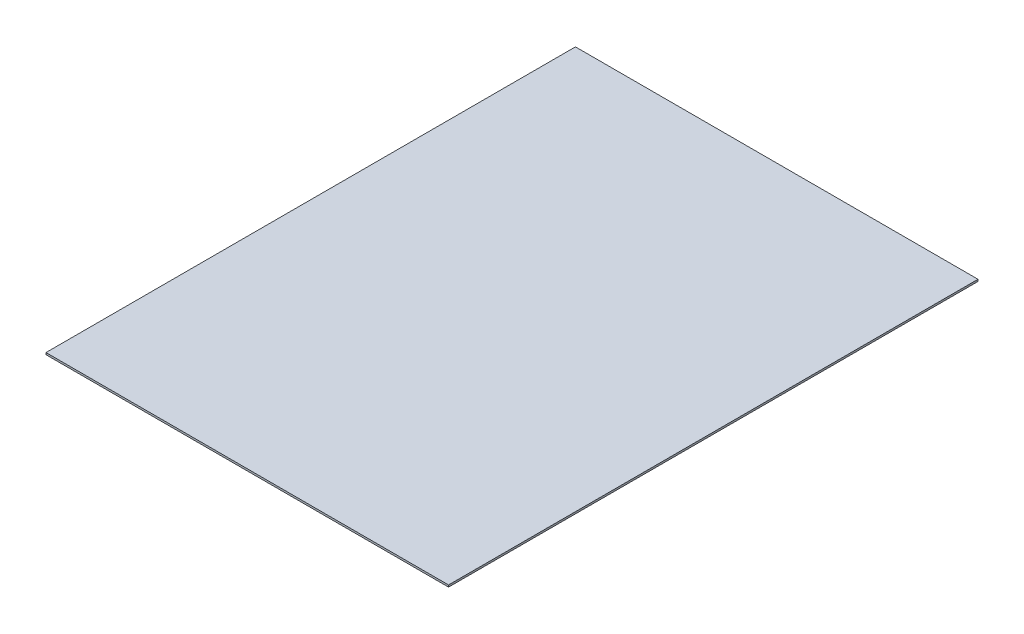
ISO-10303-21;
HEADER;
FILE_DESCRIPTION(('STEP AP214'),'2;1');
FILE_NAME('part.step','',(''),(''),'','','');
FILE_SCHEMA(('AUTOMOTIVE_DESIGN { 1 0 10303 214 1 1 1 1 }'));
ENDSEC;
DATA;
#1=APPLICATION_CONTEXT('core data for automotive mechanical design processes');
#2=APPLICATION_PROTOCOL_DEFINITION('international standard','automotive_design',2000,#1);
#3=PRODUCT_CONTEXT('',#1,'mechanical');
#4=PRODUCT('Part','Part','',(#3));
#5=PRODUCT_RELATED_PRODUCT_CATEGORY('part','',(#4));
#6=PRODUCT_DEFINITION_FORMATION('','',#4);
#7=PRODUCT_DEFINITION_CONTEXT('part definition',#1,'design');
#8=PRODUCT_DEFINITION('design','',#6,#7);
#9=PRODUCT_DEFINITION_SHAPE('','',#8);
#10=(LENGTH_UNIT() NAMED_UNIT(*) SI_UNIT(.MILLI.,.METRE.));
#11=(NAMED_UNIT(*) PLANE_ANGLE_UNIT() SI_UNIT($,.RADIAN.));
#12=(NAMED_UNIT(*) SI_UNIT($,.STERADIAN.) SOLID_ANGLE_UNIT());
#13=UNCERTAINTY_MEASURE_WITH_UNIT(LENGTH_MEASURE(1.E-05),#10,'distance_accuracy_value','');
#14=(GEOMETRIC_REPRESENTATION_CONTEXT(3) GLOBAL_UNCERTAINTY_ASSIGNED_CONTEXT((#13)) GLOBAL_UNIT_ASSIGNED_CONTEXT((#10,
#11,#12)) REPRESENTATION_CONTEXT('',''));
#15=CARTESIAN_POINT('',(0.,0.,0.));
#16=DIRECTION('',(0.,0.,1.));
#17=DIRECTION('',(1.,0.,0.));
#18=AXIS2_PLACEMENT_3D('',#15,#16,#17);
#19=CARTESIAN_POINT('',(737.5,7.,970.));
#20=DIRECTION('',(-1.,0.,0.));
#21=DIRECTION('',(0.,0.,1.));
#22=AXIS2_PLACEMENT_3D('',#19,#20,#21);
#23=PLANE('',#22);
#24=DIRECTION('',(0.,0.,-1.));
#25=VECTOR('',#24,1.);
#26=CARTESIAN_POINT('',(737.5,0.,970.));
#27=LINE('',#26,#25);
#28=CARTESIAN_POINT('',(737.5,0.,970.));
#29=VERTEX_POINT('',#28);
#30=CARTESIAN_POINT('',(737.5,0.,-970.));
#31=VERTEX_POINT('',#30);
#32=EDGE_CURVE('E97',#29,#31,#27,.T.);
#33=ORIENTED_EDGE('',*,*,#32,.T.);
#34=DIRECTION('',(0.,-1.,0.));
#35=VECTOR('',#34,1.);
#36=CARTESIAN_POINT('',(737.5,7.,-970.));
#37=LINE('',#36,#35);
#38=CARTESIAN_POINT('',(737.5,7.,-970.));
#39=VERTEX_POINT('',#38);
#40=EDGE_CURVE('E11',#39,#31,#37,.T.);
#41=ORIENTED_EDGE('',*,*,#40,.F.);
#42=DIRECTION('',(0.,0.,-1.));
#43=VECTOR('',#42,1.);
#44=CARTESIAN_POINT('',(737.5,7.,970.));
#45=LINE('',#44,#43);
#46=CARTESIAN_POINT('',(737.5,7.,970.));
#47=VERTEX_POINT('',#46);
#48=EDGE_CURVE('E85',#47,#39,#45,.T.);
#49=ORIENTED_EDGE('',*,*,#48,.F.);
#50=DIRECTION('',(0.,-1.,0.));
#51=VECTOR('',#50,1.);
#52=CARTESIAN_POINT('',(737.5,7.,970.));
#53=LINE('',#52,#51);
#54=EDGE_CURVE('E93',#47,#29,#53,.T.);
#55=ORIENTED_EDGE('',*,*,#54,.T.);
#56=EDGE_LOOP('',(#33,#41,#49,#55));
#57=FACE_BOUND('',#56,.T.);
#58=ADVANCED_FACE('F34',(#57),#23,.F.);
#59=CARTESIAN_POINT('',(-737.5,7.,-970.));
#60=DIRECTION('',(0.,0.,1.));
#61=DIRECTION('',(1.,0.,0.));
#62=AXIS2_PLACEMENT_3D('',#59,#60,#61);
#63=PLANE('',#62);
#64=DIRECTION('',(-1.,0.,0.));
#65=VECTOR('',#64,1.);
#66=CARTESIAN_POINT('',(-737.5,0.,-970.));
#67=LINE('',#66,#65);
#68=CARTESIAN_POINT('',(-737.5,0.,-970.));
#69=VERTEX_POINT('',#68);
#70=EDGE_CURVE('E89',#31,#69,#67,.T.);
#71=ORIENTED_EDGE('',*,*,#70,.T.);
#72=DIRECTION('',(0.,-1.,0.));
#73=VECTOR('',#72,1.);
#74=CARTESIAN_POINT('',(-737.5,7.,-970.));
#75=LINE('',#74,#73);
#76=CARTESIAN_POINT('',(-737.5,7.,-970.));
#77=VERTEX_POINT('',#76);
#78=EDGE_CURVE('E42',#77,#69,#75,.T.);
#79=ORIENTED_EDGE('',*,*,#78,.F.);
#80=DIRECTION('',(-1.,0.,0.));
#81=VECTOR('',#80,1.);
#82=CARTESIAN_POINT('',(-737.5,7.,-970.));
#83=LINE('',#82,#81);
#84=EDGE_CURVE('E80',#39,#77,#83,.T.);
#85=ORIENTED_EDGE('',*,*,#84,.F.);
#86=ORIENTED_EDGE('',*,*,#40,.T.);
#87=EDGE_LOOP('',(#71,#79,#85,#86));
#88=FACE_BOUND('',#87,.T.);
#89=ADVANCED_FACE('F88',(#88),#63,.F.);
#90=CARTESIAN_POINT('',(-737.5,7.,970.));
#91=DIRECTION('',(1.,0.,0.));
#92=DIRECTION('',(0.,0.,-1.));
#93=AXIS2_PLACEMENT_3D('',#90,#91,#92);
#94=PLANE('',#93);
#95=DIRECTION('',(0.,0.,1.));
#96=VECTOR('',#95,1.);
#97=CARTESIAN_POINT('',(-737.5,0.,970.));
#98=LINE('',#97,#96);
#99=CARTESIAN_POINT('',(-737.5,0.,970.));
#100=VERTEX_POINT('',#99);
#101=EDGE_CURVE('E67',#69,#100,#98,.T.);
#102=ORIENTED_EDGE('',*,*,#101,.T.);
#103=DIRECTION('',(0.,-1.,0.));
#104=VECTOR('',#103,1.);
#105=CARTESIAN_POINT('',(-737.5,7.,970.));
#106=LINE('',#105,#104);
#107=CARTESIAN_POINT('',(-737.5,7.,970.));
#108=VERTEX_POINT('',#107);
#109=EDGE_CURVE('E90',#108,#100,#106,.T.);
#110=ORIENTED_EDGE('',*,*,#109,.F.);
#111=DIRECTION('',(0.,0.,1.));
#112=VECTOR('',#111,1.);
#113=CARTESIAN_POINT('',(-737.5,7.,970.));
#114=LINE('',#113,#112);
#115=EDGE_CURVE('E83',#77,#108,#114,.T.);
#116=ORIENTED_EDGE('',*,*,#115,.F.);
#117=ORIENTED_EDGE('',*,*,#78,.T.);
#118=EDGE_LOOP('',(#102,#110,#116,#117));
#119=FACE_BOUND('',#118,.T.);
#120=ADVANCED_FACE('F91',(#119),#94,.F.);
#121=CARTESIAN_POINT('',(-737.5,7.,970.));
#122=DIRECTION('',(0.,0.,-1.));
#123=DIRECTION('',(-1.,0.,0.));
#124=AXIS2_PLACEMENT_3D('',#121,#122,#123);
#125=PLANE('',#124);
#126=DIRECTION('',(1.,0.,0.));
#127=VECTOR('',#126,1.);
#128=CARTESIAN_POINT('',(-737.5,0.,970.));
#129=LINE('',#128,#127);
#130=EDGE_CURVE('E73',#100,#29,#129,.T.);
#131=ORIENTED_EDGE('',*,*,#130,.T.);
#132=ORIENTED_EDGE('',*,*,#54,.F.);
#133=DIRECTION('',(1.,0.,0.));
#134=VECTOR('',#133,1.);
#135=CARTESIAN_POINT('',(-737.5,7.,970.));
#136=LINE('',#135,#134);
#137=EDGE_CURVE('E50',#108,#47,#136,.T.);
#138=ORIENTED_EDGE('',*,*,#137,.F.);
#139=ORIENTED_EDGE('',*,*,#109,.T.);
#140=EDGE_LOOP('',(#131,#132,#138,#139));
#141=FACE_BOUND('',#140,.T.);
#142=ADVANCED_FACE('F104',(#141),#125,.F.);
#143=CARTESIAN_POINT('',(0.,7.,0.));
#144=DIRECTION('',(0.,-1.,0.));
#145=DIRECTION('',(0.,0.,-1.));
#146=AXIS2_PLACEMENT_3D('',#143,#144,#145);
#147=PLANE('',#146);
#148=ORIENTED_EDGE('',*,*,#48,.T.);
#149=ORIENTED_EDGE('',*,*,#84,.T.);
#150=ORIENTED_EDGE('',*,*,#115,.T.);
#151=ORIENTED_EDGE('',*,*,#137,.T.);
#152=EDGE_LOOP('',(#148,#149,#150,#151));
#153=FACE_BOUND('',#152,.T.);
#154=ADVANCED_FACE('F81',(#153),#147,.F.);
#155=CARTESIAN_POINT('',(0.,0.,0.));
#156=DIRECTION('',(0.,-1.,0.));
#157=DIRECTION('',(0.,0.,-1.));
#158=AXIS2_PLACEMENT_3D('',#155,#156,#157);
#159=PLANE('',#158);
#160=ORIENTED_EDGE('',*,*,#32,.F.);
#161=ORIENTED_EDGE('',*,*,#130,.F.);
#162=ORIENTED_EDGE('',*,*,#101,.F.);
#163=ORIENTED_EDGE('',*,*,#70,.F.);
#164=EDGE_LOOP('',(#160,#161,#162,#163));
#165=FACE_BOUND('',#164,.T.);
#166=ADVANCED_FACE('F107',(#165),#159,.T.);
#167=CLOSED_SHELL('',(#58,#89,#120,#142,#154,#166));
#168=MANIFOLD_SOLID_BREP('B2',#167);
#169=ADVANCED_BREP_SHAPE_REPRESENTATION('',(#18,#168),#14);
#170=SHAPE_DEFINITION_REPRESENTATION(#9,#169);
ENDSEC;
END-ISO-10303-21;
